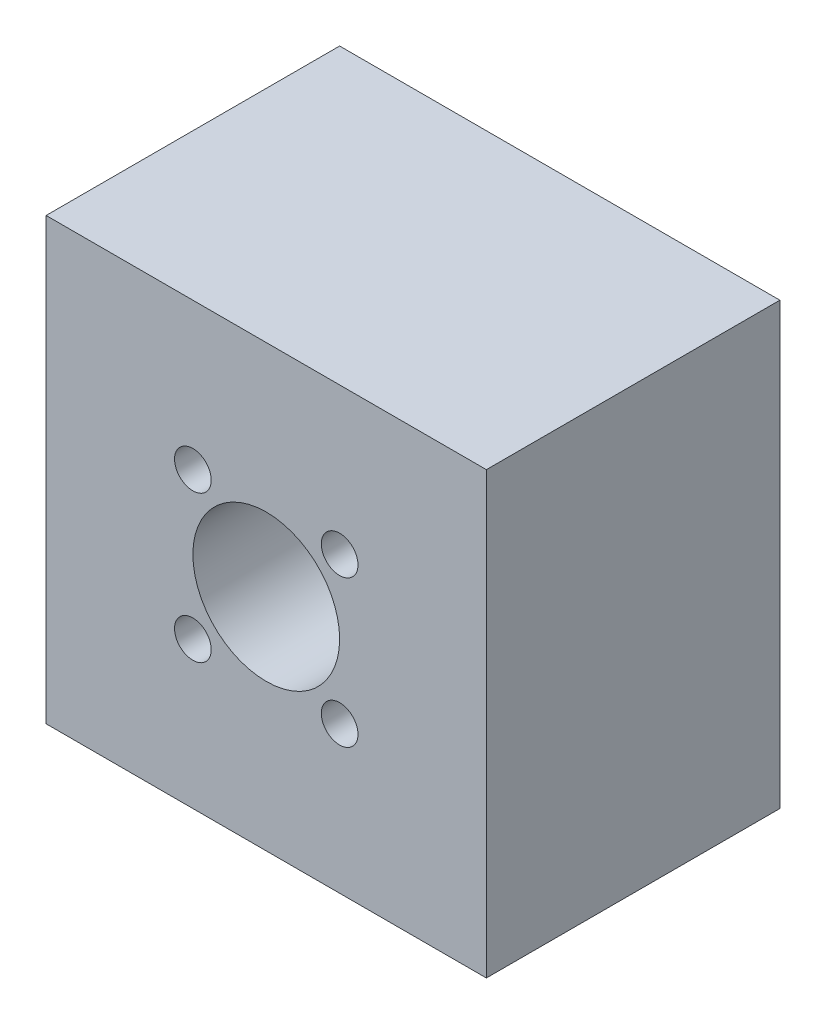
ISO-10303-21;
HEADER;
FILE_DESCRIPTION(('STEP AP214'),'2;1');
FILE_NAME('part.step','',(''),(''),'','','');
FILE_SCHEMA(('AUTOMOTIVE_DESIGN { 1 0 10303 214 1 1 1 1 }'));
ENDSEC;
DATA;
#1=APPLICATION_CONTEXT('core data for automotive mechanical design processes');
#2=APPLICATION_PROTOCOL_DEFINITION('international standard','automotive_design',2000,#1);
#3=PRODUCT_CONTEXT('',#1,'mechanical');
#4=PRODUCT('Part','Part','',(#3));
#5=PRODUCT_RELATED_PRODUCT_CATEGORY('part','',(#4));
#6=PRODUCT_DEFINITION_FORMATION('','',#4);
#7=PRODUCT_DEFINITION_CONTEXT('part definition',#1,'design');
#8=PRODUCT_DEFINITION('design','',#6,#7);
#9=PRODUCT_DEFINITION_SHAPE('','',#8);
#10=(LENGTH_UNIT() NAMED_UNIT(*) SI_UNIT(.MILLI.,.METRE.));
#11=(NAMED_UNIT(*) PLANE_ANGLE_UNIT() SI_UNIT($,.RADIAN.));
#12=(NAMED_UNIT(*) SI_UNIT($,.STERADIAN.) SOLID_ANGLE_UNIT());
#13=UNCERTAINTY_MEASURE_WITH_UNIT(LENGTH_MEASURE(1.E-05),#10,'distance_accuracy_value','');
#14=(GEOMETRIC_REPRESENTATION_CONTEXT(3) GLOBAL_UNCERTAINTY_ASSIGNED_CONTEXT((#13)) GLOBAL_UNIT_ASSIGNED_CONTEXT((#10,
#11,#12)) REPRESENTATION_CONTEXT('',''));
#15=CARTESIAN_POINT('',(0.,0.,0.));
#16=DIRECTION('',(0.,0.,1.));
#17=DIRECTION('',(1.,0.,0.));
#18=AXIS2_PLACEMENT_3D('',#15,#16,#17);
#19=CARTESIAN_POINT('',(0.,15.,10.));
#20=DIRECTION('',(0.,0.,1.));
#21=DIRECTION('',(1.,0.,0.));
#22=AXIS2_PLACEMENT_3D('',#19,#20,#21);
#23=PLANE('',#22);
#24=CARTESIAN_POINT('',(-10.,-10.,10.));
#25=DIRECTION('',(0.,0.,-1.));
#26=DIRECTION('',(1.,0.,0.));
#27=AXIS2_PLACEMENT_3D('',#24,#25,#26);
#28=CIRCLE('',#27,2.5);
#29=CARTESIAN_POINT('',(-7.5,-10.,10.));
#30=VERTEX_POINT('',#29);
#31=EDGE_CURVE('E230',#30,#30,#28,.T.);
#32=ORIENTED_EDGE('',*,*,#31,.F.);
#33=EDGE_LOOP('',(#32));
#34=FACE_BOUND('',#33,.T.);
#35=CARTESIAN_POINT('',(-10.,10.,10.));
#36=DIRECTION('',(0.,0.,-1.));
#37=DIRECTION('',(1.,0.,0.));
#38=AXIS2_PLACEMENT_3D('',#35,#36,#37);
#39=CIRCLE('',#38,2.5);
#40=CARTESIAN_POINT('',(-7.5,10.,10.));
#41=VERTEX_POINT('',#40);
#42=EDGE_CURVE('E19',#41,#41,#39,.T.);
#43=ORIENTED_EDGE('',*,*,#42,.F.);
#44=EDGE_LOOP('',(#43));
#45=FACE_BOUND('',#44,.T.);
#46=CARTESIAN_POINT('',(0.,0.,10.));
#47=DIRECTION('',(0.,0.,-1.));
#48=DIRECTION('',(1.,0.,0.));
#49=AXIS2_PLACEMENT_3D('',#46,#47,#48);
#50=CIRCLE('',#49,10.);
#51=CARTESIAN_POINT('',(0.,-10.,10.));
#52=VERTEX_POINT('',#51);
#53=CARTESIAN_POINT('',(0.,10.,10.));
#54=VERTEX_POINT('',#53);
#55=EDGE_CURVE('E171',#52,#54,#50,.T.);
#56=ORIENTED_EDGE('',*,*,#55,.F.);
#57=DIRECTION('',(0.,-1.,0.));
#58=VECTOR('',#57,1.);
#59=CARTESIAN_POINT('',(0.,15.,10.));
#60=LINE('',#59,#58);
#61=CARTESIAN_POINT('',(0.,-15.,10.));
#62=VERTEX_POINT('',#61);
#63=EDGE_CURVE('E166',#52,#62,#60,.T.);
#64=ORIENTED_EDGE('',*,*,#63,.T.);
#65=DIRECTION('',(-1.,0.,0.));
#66=VECTOR('',#65,1.);
#67=CARTESIAN_POINT('',(0.,-15.,10.));
#68=LINE('',#67,#66);
#69=CARTESIAN_POINT('',(-15.,-15.,10.));
#70=VERTEX_POINT('',#69);
#71=EDGE_CURVE('E261',#62,#70,#68,.T.);
#72=ORIENTED_EDGE('',*,*,#71,.T.);
#73=DIRECTION('',(0.,-1.,0.));
#74=VECTOR('',#73,1.);
#75=CARTESIAN_POINT('',(-15.,15.,10.));
#76=LINE('',#75,#74);
#77=CARTESIAN_POINT('',(-15.,15.,10.));
#78=VERTEX_POINT('',#77);
#79=EDGE_CURVE('E231',#78,#70,#76,.T.);
#80=ORIENTED_EDGE('',*,*,#79,.F.);
#81=DIRECTION('',(-1.,0.,0.));
#82=VECTOR('',#81,1.);
#83=CARTESIAN_POINT('',(0.,15.,10.));
#84=LINE('',#83,#82);
#85=CARTESIAN_POINT('',(0.,15.,10.));
#86=VERTEX_POINT('',#85);
#87=EDGE_CURVE('E254',#86,#78,#84,.T.);
#88=ORIENTED_EDGE('',*,*,#87,.F.);
#89=DIRECTION('',(0.,-1.,0.));
#90=VECTOR('',#89,1.);
#91=CARTESIAN_POINT('',(0.,15.,10.));
#92=LINE('',#91,#90);
#93=EDGE_CURVE('E242',#86,#54,#92,.T.);
#94=ORIENTED_EDGE('',*,*,#93,.T.);
#95=EDGE_LOOP('',(#56,#64,#72,#80,#88,#94));
#96=FACE_BOUND('',#95,.T.);
#97=ADVANCED_FACE('F16',(#34,#45,#96),#23,.F.);
#98=CARTESIAN_POINT('',(-10.,10.,0.));
#99=DIRECTION('',(0.,0.,-1.));
#100=DIRECTION('',(1.,0.,0.));
#101=AXIS2_PLACEMENT_3D('',#98,#99,#100);
#102=CYLINDRICAL_SURFACE('',#101,2.5);
#103=ORIENTED_EDGE('',*,*,#42,.T.);
#104=DIRECTION('',(0.,0.,1.));
#105=VECTOR('',#104,1.);
#106=CARTESIAN_POINT('',(-7.5,10.,0.));
#107=LINE('',#106,#105);
#108=CARTESIAN_POINT('',(-7.5,10.,40.));
#109=VERTEX_POINT('',#108);
#110=EDGE_CURVE('E10',#41,#109,#107,.T.);
#111=ORIENTED_EDGE('',*,*,#110,.T.);
#112=CARTESIAN_POINT('',(-10.,10.,40.));
#113=DIRECTION('',(0.,0.,-1.));
#114=DIRECTION('',(1.,0.,0.));
#115=AXIS2_PLACEMENT_3D('',#112,#113,#114);
#116=CIRCLE('',#115,2.5);
#117=EDGE_CURVE('E218',#109,#109,#116,.T.);
#118=ORIENTED_EDGE('',*,*,#117,.F.);
#119=ORIENTED_EDGE('',*,*,#110,.F.);
#120=EDGE_LOOP('',(#103,#111,#118,#119));
#121=FACE_BOUND('',#120,.T.);
#122=ADVANCED_FACE('F376',(#121),#102,.F.);
#123=CARTESIAN_POINT('',(-10.,-10.,0.));
#124=DIRECTION('',(0.,0.,-1.));
#125=DIRECTION('',(1.,0.,0.));
#126=AXIS2_PLACEMENT_3D('',#123,#124,#125);
#127=CYLINDRICAL_SURFACE('',#126,2.5);
#128=ORIENTED_EDGE('',*,*,#31,.T.);
#129=DIRECTION('',(0.,0.,1.));
#130=VECTOR('',#129,1.);
#131=CARTESIAN_POINT('',(-7.5,-10.,0.));
#132=LINE('',#131,#130);
#133=CARTESIAN_POINT('',(-7.5,-10.,40.));
#134=VERTEX_POINT('',#133);
#135=EDGE_CURVE('E44',#30,#134,#132,.T.);
#136=ORIENTED_EDGE('',*,*,#135,.T.);
#137=CARTESIAN_POINT('',(-10.,-10.,40.));
#138=DIRECTION('',(0.,0.,-1.));
#139=DIRECTION('',(1.,0.,0.));
#140=AXIS2_PLACEMENT_3D('',#137,#138,#139);
#141=CIRCLE('',#140,2.5);
#142=EDGE_CURVE('E207',#134,#134,#141,.T.);
#143=ORIENTED_EDGE('',*,*,#142,.F.);
#144=ORIENTED_EDGE('',*,*,#135,.F.);
#145=EDGE_LOOP('',(#128,#136,#143,#144));
#146=FACE_BOUND('',#145,.T.);
#147=ADVANCED_FACE('F384',(#146),#127,.F.);
#148=CARTESIAN_POINT('',(10.,10.,0.));
#149=DIRECTION('',(0.,0.,-1.));
#150=DIRECTION('',(1.,0.,0.));
#151=AXIS2_PLACEMENT_3D('',#148,#149,#150);
#152=CYLINDRICAL_SURFACE('',#151,2.5);
#153=CARTESIAN_POINT('',(10.,10.,0.));
#154=DIRECTION('',(0.,0.,1.));
#155=DIRECTION('',(1.,0.,0.));
#156=AXIS2_PLACEMENT_3D('',#153,#154,#155);
#157=CIRCLE('',#156,2.5);
#158=CARTESIAN_POINT('',(12.5,10.,0.));
#159=VERTEX_POINT('',#158);
#160=EDGE_CURVE('E200',#159,#159,#157,.T.);
#161=ORIENTED_EDGE('',*,*,#160,.F.);
#162=DIRECTION('',(0.,0.,1.));
#163=VECTOR('',#162,1.);
#164=CARTESIAN_POINT('',(12.5,10.,0.));
#165=LINE('',#164,#163);
#166=CARTESIAN_POINT('',(12.5,10.,40.));
#167=VERTEX_POINT('',#166);
#168=EDGE_CURVE('E227',#159,#167,#165,.T.);
#169=ORIENTED_EDGE('',*,*,#168,.T.);
#170=CARTESIAN_POINT('',(10.,10.,40.));
#171=DIRECTION('',(0.,0.,-1.));
#172=DIRECTION('',(1.,0.,0.));
#173=AXIS2_PLACEMENT_3D('',#170,#171,#172);
#174=CIRCLE('',#173,2.5);
#175=EDGE_CURVE('E226',#167,#167,#174,.T.);
#176=ORIENTED_EDGE('',*,*,#175,.F.);
#177=ORIENTED_EDGE('',*,*,#168,.F.);
#178=EDGE_LOOP('',(#161,#169,#176,#177));
#179=FACE_BOUND('',#178,.T.);
#180=ADVANCED_FACE('F388',(#179),#152,.F.);
#181=CARTESIAN_POINT('',(-15.,0.,0.));
#182=DIRECTION('',(1.,0.,0.));
#183=DIRECTION('',(0.,1.,0.));
#184=AXIS2_PLACEMENT_3D('',#181,#182,#183);
#185=PLANE('',#184);
#186=DIRECTION('',(0.,0.,-1.));
#187=VECTOR('',#186,1.);
#188=CARTESIAN_POINT('',(-15.,-15.,10.));
#189=LINE('',#188,#187);
#190=CARTESIAN_POINT('',(-15.,-15.,0.));
#191=VERTEX_POINT('',#190);
#192=EDGE_CURVE('E259',#70,#191,#189,.T.);
#193=ORIENTED_EDGE('',*,*,#192,.T.);
#194=DIRECTION('',(0.,1.,0.));
#195=VECTOR('',#194,1.);
#196=CARTESIAN_POINT('',(-15.,0.,0.));
#197=LINE('',#196,#195);
#198=CARTESIAN_POINT('',(-15.,15.,0.));
#199=VERTEX_POINT('',#198);
#200=EDGE_CURVE('E194',#191,#199,#197,.T.);
#201=ORIENTED_EDGE('',*,*,#200,.T.);
#202=DIRECTION('',(0.,0.,1.));
#203=VECTOR('',#202,1.);
#204=CARTESIAN_POINT('',(-15.,15.,-10.));
#205=LINE('',#204,#203);
#206=EDGE_CURVE('E258',#199,#78,#205,.T.);
#207=ORIENTED_EDGE('',*,*,#206,.T.);
#208=ORIENTED_EDGE('',*,*,#79,.T.);
#209=EDGE_LOOP('',(#193,#201,#207,#208));
#210=FACE_BOUND('',#209,.T.);
#211=ADVANCED_FACE('F340',(#210),#185,.T.);
#212=CARTESIAN_POINT('',(0.,-15.,10.));
#213=DIRECTION('',(0.,-1.,0.));
#214=DIRECTION('',(0.,0.,-1.));
#215=AXIS2_PLACEMENT_3D('',#212,#213,#214);
#216=PLANE('',#215);
#217=DIRECTION('',(1.,0.,0.));
#218=VECTOR('',#217,1.);
#219=CARTESIAN_POINT('',(0.,-15.,0.));
#220=LINE('',#219,#218);
#221=CARTESIAN_POINT('',(0.,-15.,0.));
#222=VERTEX_POINT('',#221);
#223=EDGE_CURVE('E189',#191,#222,#220,.T.);
#224=ORIENTED_EDGE('',*,*,#223,.F.);
#225=ORIENTED_EDGE('',*,*,#192,.F.);
#226=ORIENTED_EDGE('',*,*,#71,.F.);
#227=DIRECTION('',(0.,0.,-1.));
#228=VECTOR('',#227,1.);
#229=CARTESIAN_POINT('',(0.,-15.,10.));
#230=LINE('',#229,#228);
#231=EDGE_CURVE('E251',#62,#222,#230,.T.);
#232=ORIENTED_EDGE('',*,*,#231,.T.);
#233=EDGE_LOOP('',(#224,#225,#226,#232));
#234=FACE_BOUND('',#233,.T.);
#235=ADVANCED_FACE('F342',(#234),#216,.F.);
#236=CARTESIAN_POINT('',(0.,15.,-10.));
#237=DIRECTION('',(0.,1.,0.));
#238=DIRECTION('',(1.,0.,0.));
#239=AXIS2_PLACEMENT_3D('',#236,#237,#238);
#240=PLANE('',#239);
#241=ORIENTED_EDGE('',*,*,#87,.T.);
#242=ORIENTED_EDGE('',*,*,#206,.F.);
#243=DIRECTION('',(-1.,0.,0.));
#244=VECTOR('',#243,1.);
#245=CARTESIAN_POINT('',(0.,15.,0.));
#246=LINE('',#245,#244);
#247=CARTESIAN_POINT('',(0.,15.,0.));
#248=VERTEX_POINT('',#247);
#249=EDGE_CURVE('E289',#248,#199,#246,.T.);
#250=ORIENTED_EDGE('',*,*,#249,.F.);
#251=DIRECTION('',(0.,0.,1.));
#252=VECTOR('',#251,1.);
#253=CARTESIAN_POINT('',(0.,15.,-10.));
#254=LINE('',#253,#252);
#255=EDGE_CURVE('E245',#248,#86,#254,.T.);
#256=ORIENTED_EDGE('',*,*,#255,.T.);
#257=EDGE_LOOP('',(#241,#242,#250,#256));
#258=FACE_BOUND('',#257,.T.);
#259=ADVANCED_FACE('F339',(#258),#240,.F.);
#260=CARTESIAN_POINT('',(0.,0.,0.));
#261=DIRECTION('',(1.,0.,0.));
#262=DIRECTION('',(0.,1.,0.));
#263=AXIS2_PLACEMENT_3D('',#260,#261,#262);
#264=PLANE('',#263);
#265=ORIENTED_EDGE('',*,*,#63,.F.);
#266=DIRECTION('',(0.,0.,-1.));
#267=VECTOR('',#266,1.);
#268=CARTESIAN_POINT('',(0.,-10.,0.));
#269=LINE('',#268,#267);
#270=CARTESIAN_POINT('',(0.,-10.,0.));
#271=VERTEX_POINT('',#270);
#272=EDGE_CURVE('E158',#52,#271,#269,.T.);
#273=ORIENTED_EDGE('',*,*,#272,.T.);
#274=DIRECTION('',(0.,1.,0.));
#275=VECTOR('',#274,1.);
#276=CARTESIAN_POINT('',(0.,0.,0.));
#277=LINE('',#276,#275);
#278=EDGE_CURVE('E163',#222,#271,#277,.T.);
#279=ORIENTED_EDGE('',*,*,#278,.F.);
#280=ORIENTED_EDGE('',*,*,#231,.F.);
#281=EDGE_LOOP('',(#265,#273,#279,#280));
#282=FACE_BOUND('',#281,.T.);
#283=ADVANCED_FACE('F160',(#282),#264,.F.);
#284=CARTESIAN_POINT('',(0.,0.,0.));
#285=DIRECTION('',(1.,0.,0.));
#286=DIRECTION('',(0.,1.,0.));
#287=AXIS2_PLACEMENT_3D('',#284,#285,#286);
#288=PLANE('',#287);
#289=DIRECTION('',(0.,0.,-1.));
#290=VECTOR('',#289,1.);
#291=CARTESIAN_POINT('',(0.,10.,0.));
#292=LINE('',#291,#290);
#293=CARTESIAN_POINT('',(0.,10.,0.));
#294=VERTEX_POINT('',#293);
#295=EDGE_CURVE('E210',#54,#294,#292,.T.);
#296=ORIENTED_EDGE('',*,*,#295,.F.);
#297=ORIENTED_EDGE('',*,*,#93,.F.);
#298=ORIENTED_EDGE('',*,*,#255,.F.);
#299=DIRECTION('',(0.,1.,0.));
#300=VECTOR('',#299,1.);
#301=CARTESIAN_POINT('',(0.,0.,0.));
#302=LINE('',#301,#300);
#303=EDGE_CURVE('E314',#294,#248,#302,.T.);
#304=ORIENTED_EDGE('',*,*,#303,.F.);
#305=EDGE_LOOP('',(#296,#297,#298,#304));
#306=FACE_BOUND('',#305,.T.);
#307=ADVANCED_FACE('F336',(#306),#288,.F.);
#308=CARTESIAN_POINT('',(0.,0.,0.));
#309=DIRECTION('',(0.,0.,-1.));
#310=DIRECTION('',(1.,0.,0.));
#311=AXIS2_PLACEMENT_3D('',#308,#309,#310);
#312=CYLINDRICAL_SURFACE('',#311,10.);
#313=DIRECTION('',(0.,0.,1.));
#314=VECTOR('',#313,1.);
#315=CARTESIAN_POINT('',(10.,0.,0.));
#316=LINE('',#315,#314);
#317=CARTESIAN_POINT('',(10.,0.,0.));
#318=VERTEX_POINT('',#317);
#319=CARTESIAN_POINT('',(10.,0.,40.));
#320=VERTEX_POINT('',#319);
#321=EDGE_CURVE('E172',#318,#320,#316,.T.);
#322=ORIENTED_EDGE('',*,*,#321,.F.);
#323=CARTESIAN_POINT('',(0.,0.,0.));
#324=DIRECTION('',(0.,0.,1.));
#325=DIRECTION('',(1.,0.,0.));
#326=AXIS2_PLACEMENT_3D('',#323,#324,#325);
#327=CIRCLE('',#326,10.);
#328=EDGE_CURVE('E175',#271,#318,#327,.T.);
#329=ORIENTED_EDGE('',*,*,#328,.F.);
#330=ORIENTED_EDGE('',*,*,#272,.F.);
#331=ORIENTED_EDGE('',*,*,#55,.T.);
#332=ORIENTED_EDGE('',*,*,#295,.T.);
#333=CARTESIAN_POINT('',(0.,0.,0.));
#334=DIRECTION('',(0.,0.,1.));
#335=DIRECTION('',(1.,0.,0.));
#336=AXIS2_PLACEMENT_3D('',#333,#334,#335);
#337=CIRCLE('',#336,10.);
#338=EDGE_CURVE('E182',#318,#294,#337,.T.);
#339=ORIENTED_EDGE('',*,*,#338,.F.);
#340=ORIENTED_EDGE('',*,*,#321,.T.);
#341=CARTESIAN_POINT('',(0.,0.,40.));
#342=DIRECTION('',(0.,0.,-1.));
#343=DIRECTION('',(1.,0.,0.));
#344=AXIS2_PLACEMENT_3D('',#341,#342,#343);
#345=CIRCLE('',#344,10.);
#346=EDGE_CURVE('E222',#320,#320,#345,.T.);
#347=ORIENTED_EDGE('',*,*,#346,.F.);
#348=EDGE_LOOP('',(#322,#329,#330,#331,#332,#339,#340,#347));
#349=FACE_BOUND('',#348,.T.);
#350=ADVANCED_FACE('F176',(#349),#312,.F.);
#351=CARTESIAN_POINT('',(10.,-10.,0.));
#352=DIRECTION('',(0.,0.,-1.));
#353=DIRECTION('',(1.,0.,0.));
#354=AXIS2_PLACEMENT_3D('',#351,#352,#353);
#355=CYLINDRICAL_SURFACE('',#354,2.5);
#356=CARTESIAN_POINT('',(10.,-10.,0.));
#357=DIRECTION('',(0.,0.,1.));
#358=DIRECTION('',(1.,0.,0.));
#359=AXIS2_PLACEMENT_3D('',#356,#357,#358);
#360=CIRCLE('',#359,2.5);
#361=CARTESIAN_POINT('',(12.5,-10.,0.));
#362=VERTEX_POINT('',#361);
#363=EDGE_CURVE('E304',#362,#362,#360,.T.);
#364=ORIENTED_EDGE('',*,*,#363,.F.);
#365=DIRECTION('',(0.,0.,1.));
#366=VECTOR('',#365,1.);
#367=CARTESIAN_POINT('',(12.5,-10.,0.));
#368=LINE('',#367,#366);
#369=CARTESIAN_POINT('',(12.5,-10.,40.));
#370=VERTEX_POINT('',#369);
#371=EDGE_CURVE('E235',#362,#370,#368,.T.);
#372=ORIENTED_EDGE('',*,*,#371,.T.);
#373=CARTESIAN_POINT('',(10.,-10.,40.));
#374=DIRECTION('',(0.,0.,-1.));
#375=DIRECTION('',(1.,0.,0.));
#376=AXIS2_PLACEMENT_3D('',#373,#374,#375);
#377=CIRCLE('',#376,2.5);
#378=EDGE_CURVE('E213',#370,#370,#377,.T.);
#379=ORIENTED_EDGE('',*,*,#378,.F.);
#380=ORIENTED_EDGE('',*,*,#371,.F.);
#381=EDGE_LOOP('',(#364,#372,#379,#380));
#382=FACE_BOUND('',#381,.T.);
#383=ADVANCED_FACE('F404',(#382),#355,.F.);
#384=CARTESIAN_POINT('',(30.,30.,0.));
#385=DIRECTION('',(0.,-1.,0.));
#386=DIRECTION('',(0.,0.,-1.));
#387=AXIS2_PLACEMENT_3D('',#384,#385,#386);
#388=PLANE('',#387);
#389=DIRECTION('',(-1.,0.,0.));
#390=VECTOR('',#389,1.);
#391=CARTESIAN_POINT('',(30.,30.,0.));
#392=LINE('',#391,#390);
#393=CARTESIAN_POINT('',(30.,30.,0.));
#394=VERTEX_POINT('',#393);
#395=CARTESIAN_POINT('',(-30.,30.,0.));
#396=VERTEX_POINT('',#395);
#397=EDGE_CURVE('E299',#394,#396,#392,.T.);
#398=ORIENTED_EDGE('',*,*,#397,.T.);
#399=DIRECTION('',(0.,0.,1.));
#400=VECTOR('',#399,1.);
#401=CARTESIAN_POINT('',(-30.,30.,0.));
#402=LINE('',#401,#400);
#403=CARTESIAN_POINT('',(-30.,30.,40.));
#404=VERTEX_POINT('',#403);
#405=EDGE_CURVE('E280',#396,#404,#402,.T.);
#406=ORIENTED_EDGE('',*,*,#405,.T.);
#407=DIRECTION('',(-1.,0.,0.));
#408=VECTOR('',#407,1.);
#409=CARTESIAN_POINT('',(30.,30.,40.));
#410=LINE('',#409,#408);
#411=CARTESIAN_POINT('',(30.,30.,40.));
#412=VERTEX_POINT('',#411);
#413=EDGE_CURVE('E204',#412,#404,#410,.T.);
#414=ORIENTED_EDGE('',*,*,#413,.F.);
#415=DIRECTION('',(0.,0.,1.));
#416=VECTOR('',#415,1.);
#417=CARTESIAN_POINT('',(30.,30.,0.));
#418=LINE('',#417,#416);
#419=EDGE_CURVE('E293',#394,#412,#418,.T.);
#420=ORIENTED_EDGE('',*,*,#419,.F.);
#421=EDGE_LOOP('',(#398,#406,#414,#420));
#422=FACE_BOUND('',#421,.T.);
#423=ADVANCED_FACE('F347',(#422),#388,.F.);
#424=CARTESIAN_POINT('',(0.,0.,40.));
#425=DIRECTION('',(0.,0.,1.));
#426=DIRECTION('',(1.,0.,0.));
#427=AXIS2_PLACEMENT_3D('',#424,#425,#426);
#428=PLANE('',#427);
#429=ORIENTED_EDGE('',*,*,#175,.T.);
#430=EDGE_LOOP('',(#429));
#431=FACE_BOUND('',#430,.T.);
#432=ORIENTED_EDGE('',*,*,#346,.T.);
#433=EDGE_LOOP('',(#432));
#434=FACE_BOUND('',#433,.T.);
#435=ORIENTED_EDGE('',*,*,#117,.T.);
#436=EDGE_LOOP('',(#435));
#437=FACE_BOUND('',#436,.T.);
#438=ORIENTED_EDGE('',*,*,#378,.T.);
#439=EDGE_LOOP('',(#438));
#440=FACE_BOUND('',#439,.T.);
#441=ORIENTED_EDGE('',*,*,#142,.T.);
#442=EDGE_LOOP('',(#441));
#443=FACE_BOUND('',#442,.T.);
#444=DIRECTION('',(1.,0.,0.));
#445=VECTOR('',#444,1.);
#446=CARTESIAN_POINT('',(-30.,-30.,40.));
#447=LINE('',#446,#445);
#448=CARTESIAN_POINT('',(-30.,-30.,40.));
#449=VERTEX_POINT('',#448);
#450=CARTESIAN_POINT('',(30.,-30.,40.));
#451=VERTEX_POINT('',#450);
#452=EDGE_CURVE('E319',#449,#451,#447,.T.);
#453=ORIENTED_EDGE('',*,*,#452,.T.);
#454=DIRECTION('',(0.,1.,0.));
#455=VECTOR('',#454,1.);
#456=CARTESIAN_POINT('',(30.,-30.,40.));
#457=LINE('',#456,#455);
#458=EDGE_CURVE('E296',#451,#412,#457,.T.);
#459=ORIENTED_EDGE('',*,*,#458,.T.);
#460=ORIENTED_EDGE('',*,*,#413,.T.);
#461=DIRECTION('',(0.,-1.,0.));
#462=VECTOR('',#461,1.);
#463=CARTESIAN_POINT('',(-30.,30.,40.));
#464=LINE('',#463,#462);
#465=EDGE_CURVE('E278',#404,#449,#464,.T.);
#466=ORIENTED_EDGE('',*,*,#465,.T.);
#467=EDGE_LOOP('',(#453,#459,#460,#466));
#468=FACE_BOUND('',#467,.T.);
#469=ADVANCED_FACE('F344',(#431,#434,#437,#440,#443,#468),#428,.T.);
#470=CARTESIAN_POINT('',(0.,0.,0.));
#471=DIRECTION('',(0.,0.,1.));
#472=DIRECTION('',(1.,0.,0.));
#473=AXIS2_PLACEMENT_3D('',#470,#471,#472);
#474=PLANE('',#473);
#475=ORIENTED_EDGE('',*,*,#160,.T.);
#476=EDGE_LOOP('',(#475));
#477=FACE_BOUND('',#476,.T.);
#478=ORIENTED_EDGE('',*,*,#303,.T.);
#479=ORIENTED_EDGE('',*,*,#249,.T.);
#480=ORIENTED_EDGE('',*,*,#200,.F.);
#481=ORIENTED_EDGE('',*,*,#223,.T.);
#482=ORIENTED_EDGE('',*,*,#278,.T.);
#483=ORIENTED_EDGE('',*,*,#328,.T.);
#484=ORIENTED_EDGE('',*,*,#338,.T.);
#485=EDGE_LOOP('',(#478,#479,#480,#481,#482,#483,#484));
#486=FACE_BOUND('',#485,.T.);
#487=ORIENTED_EDGE('',*,*,#363,.T.);
#488=EDGE_LOOP('',(#487));
#489=FACE_BOUND('',#488,.T.);
#490=DIRECTION('',(0.,-1.,0.));
#491=VECTOR('',#490,1.);
#492=CARTESIAN_POINT('',(-30.,30.,0.));
#493=LINE('',#492,#491);
#494=CARTESIAN_POINT('',(-30.,-30.,0.));
#495=VERTEX_POINT('',#494);
#496=EDGE_CURVE('E281',#396,#495,#493,.T.);
#497=ORIENTED_EDGE('',*,*,#496,.F.);
#498=ORIENTED_EDGE('',*,*,#397,.F.);
#499=DIRECTION('',(0.,1.,0.));
#500=VECTOR('',#499,1.);
#501=CARTESIAN_POINT('',(30.,-30.,0.));
#502=LINE('',#501,#500);
#503=CARTESIAN_POINT('',(30.,-30.,0.));
#504=VERTEX_POINT('',#503);
#505=EDGE_CURVE('E285',#504,#394,#502,.T.);
#506=ORIENTED_EDGE('',*,*,#505,.F.);
#507=DIRECTION('',(1.,0.,0.));
#508=VECTOR('',#507,1.);
#509=CARTESIAN_POINT('',(-30.,-30.,0.));
#510=LINE('',#509,#508);
#511=EDGE_CURVE('E362',#495,#504,#510,.T.);
#512=ORIENTED_EDGE('',*,*,#511,.F.);
#513=EDGE_LOOP('',(#497,#498,#506,#512));
#514=FACE_BOUND('',#513,.T.);
#515=ADVANCED_FACE('F185',(#477,#486,#489,#514),#474,.F.);
#516=CARTESIAN_POINT('',(30.,-30.,0.));
#517=DIRECTION('',(-1.,0.,0.));
#518=DIRECTION('',(0.,0.,1.));
#519=AXIS2_PLACEMENT_3D('',#516,#517,#518);
#520=PLANE('',#519);
#521=ORIENTED_EDGE('',*,*,#505,.T.);
#522=ORIENTED_EDGE('',*,*,#419,.T.);
#523=ORIENTED_EDGE('',*,*,#458,.F.);
#524=DIRECTION('',(0.,0.,1.));
#525=VECTOR('',#524,1.);
#526=CARTESIAN_POINT('',(30.,-30.,0.));
#527=LINE('',#526,#525);
#528=EDGE_CURVE('E322',#504,#451,#527,.T.);
#529=ORIENTED_EDGE('',*,*,#528,.F.);
#530=EDGE_LOOP('',(#521,#522,#523,#529));
#531=FACE_BOUND('',#530,.T.);
#532=ADVANCED_FACE('F407',(#531),#520,.F.);
#533=CARTESIAN_POINT('',(-30.,30.,0.));
#534=DIRECTION('',(1.,0.,0.));
#535=DIRECTION('',(0.,1.,0.));
#536=AXIS2_PLACEMENT_3D('',#533,#534,#535);
#537=PLANE('',#536);
#538=ORIENTED_EDGE('',*,*,#496,.T.);
#539=DIRECTION('',(0.,0.,1.));
#540=VECTOR('',#539,1.);
#541=CARTESIAN_POINT('',(-30.,-30.,0.));
#542=LINE('',#541,#540);
#543=EDGE_CURVE('E321',#495,#449,#542,.T.);
#544=ORIENTED_EDGE('',*,*,#543,.T.);
#545=ORIENTED_EDGE('',*,*,#465,.F.);
#546=ORIENTED_EDGE('',*,*,#405,.F.);
#547=EDGE_LOOP('',(#538,#544,#545,#546));
#548=FACE_BOUND('',#547,.T.);
#549=ADVANCED_FACE('F411',(#548),#537,.F.);
#550=CARTESIAN_POINT('',(-30.,-30.,0.));
#551=DIRECTION('',(0.,1.,0.));
#552=DIRECTION('',(1.,0.,0.));
#553=AXIS2_PLACEMENT_3D('',#550,#551,#552);
#554=PLANE('',#553);
#555=ORIENTED_EDGE('',*,*,#511,.T.);
#556=ORIENTED_EDGE('',*,*,#528,.T.);
#557=ORIENTED_EDGE('',*,*,#452,.F.);
#558=ORIENTED_EDGE('',*,*,#543,.F.);
#559=EDGE_LOOP('',(#555,#556,#557,#558));
#560=FACE_BOUND('',#559,.T.);
#561=ADVANCED_FACE('F360',(#560),#554,.F.);
#562=CLOSED_SHELL('',(#97,#122,#147,#180,#211,#235,#259,#283,#307,#350,#383,#423,#469,#515,#532,
#549,#561));
#563=MANIFOLD_SOLID_BREP('B1',#562);
#564=ADVANCED_BREP_SHAPE_REPRESENTATION('',(#18,#563),#14);
#565=SHAPE_DEFINITION_REPRESENTATION(#9,#564);
ENDSEC;
END-ISO-10303-21;
